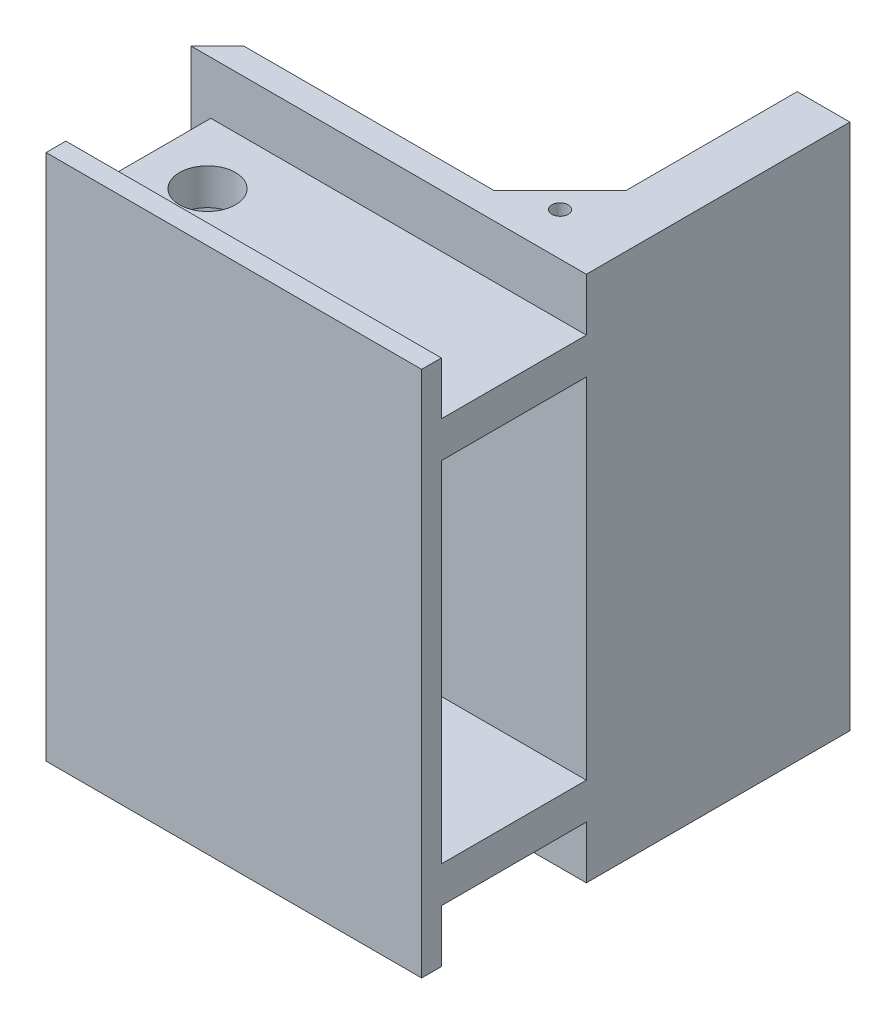
ISO-10303-21;
HEADER;
FILE_DESCRIPTION(('STEP AP214'),'2;1');
FILE_NAME('part.step','',(''),(''),'','','');
FILE_SCHEMA(('AUTOMOTIVE_DESIGN { 1 0 10303 214 1 1 1 1 }'));
ENDSEC;
DATA;
#1=APPLICATION_CONTEXT('core data for automotive mechanical design processes');
#2=APPLICATION_PROTOCOL_DEFINITION('international standard','automotive_design',2000,#1);
#3=PRODUCT_CONTEXT('',#1,'mechanical');
#4=PRODUCT('Part','Part','',(#3));
#5=PRODUCT_RELATED_PRODUCT_CATEGORY('part','',(#4));
#6=PRODUCT_DEFINITION_FORMATION('','',#4);
#7=PRODUCT_DEFINITION_CONTEXT('part definition',#1,'design');
#8=PRODUCT_DEFINITION('design','',#6,#7);
#9=PRODUCT_DEFINITION_SHAPE('','',#8);
#10=(LENGTH_UNIT() NAMED_UNIT(*) SI_UNIT(.MILLI.,.METRE.));
#11=(NAMED_UNIT(*) PLANE_ANGLE_UNIT() SI_UNIT($,.RADIAN.));
#12=(NAMED_UNIT(*) SI_UNIT($,.STERADIAN.) SOLID_ANGLE_UNIT());
#13=UNCERTAINTY_MEASURE_WITH_UNIT(LENGTH_MEASURE(1.E-05),#10,'distance_accuracy_value','');
#14=(GEOMETRIC_REPRESENTATION_CONTEXT(3) GLOBAL_UNCERTAINTY_ASSIGNED_CONTEXT((#13)) GLOBAL_UNIT_ASSIGNED_CONTEXT((#10,
#11,#12)) REPRESENTATION_CONTEXT('',''));
#15=CARTESIAN_POINT('',(0.,0.,0.));
#16=DIRECTION('',(0.,0.,1.));
#17=DIRECTION('',(1.,0.,0.));
#18=AXIS2_PLACEMENT_3D('',#15,#16,#17);
#19=CARTESIAN_POINT('',(-15.3516499079451,0.,15.687272498387));
#20=DIRECTION('',(0.707106781186544,0.,0.707106781186551));
#21=DIRECTION('',(0.,-1.,0.));
#22=AXIS2_PLACEMENT_3D('',#19,#20,#21);
#23=PLANE('',#22);
#24=DIRECTION('',(0.707106781186551,0.,-0.707106781186544));
#25=VECTOR('',#24,1.);
#26=CARTESIAN_POINT('',(-15.3516499079451,-4.00000000000001,15.687272498387));
#27=LINE('',#26,#25);
#28=CARTESIAN_POINT('',(-15.3516499079451,-4.00000000000001,15.687272498387));
#29=VERTEX_POINT('',#28);
#30=CARTESIAN_POINT('',(-5.35164990794507,-4.00000000000001,5.68727249838705));
#31=VERTEX_POINT('',#30);
#32=EDGE_CURVE('E11',#29,#31,#27,.T.);
#33=ORIENTED_EDGE('',*,*,#32,.F.);
#34=DIRECTION('',(0.,-1.,0.));
#35=VECTOR('',#34,1.);
#36=CARTESIAN_POINT('',(-15.3516499079451,0.,15.687272498387));
#37=LINE('',#36,#35);
#38=CARTESIAN_POINT('',(-15.3516499079451,0.,15.687272498387));
#39=VERTEX_POINT('',#38);
#40=EDGE_CURVE('E363',#39,#29,#37,.T.);
#41=ORIENTED_EDGE('',*,*,#40,.F.);
#42=DIRECTION('',(-0.707106781186551,0.,0.707106781186544));
#43=VECTOR('',#42,1.);
#44=CARTESIAN_POINT('',(-15.3516499079451,0.,15.687272498387));
#45=LINE('',#44,#43);
#46=CARTESIAN_POINT('',(-5.35164990794507,0.,5.68727249838709));
#47=VERTEX_POINT('',#46);
#48=EDGE_CURVE('E372',#47,#39,#45,.T.);
#49=ORIENTED_EDGE('',*,*,#48,.F.);
#50=DIRECTION('',(0.,1.,0.));
#51=VECTOR('',#50,1.);
#52=CARTESIAN_POINT('',(-5.35164990794507,0.,5.68727249838709));
#53=LINE('',#52,#51);
#54=EDGE_CURVE('E366',#31,#47,#53,.T.);
#55=ORIENTED_EDGE('',*,*,#54,.F.);
#56=EDGE_LOOP('',(#33,#41,#49,#55));
#57=FACE_BOUND('',#56,.T.);
#58=ADVANCED_FACE('F44',(#57),#23,.F.);
#59=DIRECTION('',(-0.707106781186551,0.,0.707106781186544));
#60=VECTOR('',#59,1.);
#61=CARTESIAN_POINT('',(-15.3516499079451,-76.,15.687272498387));
#62=LINE('',#61,#60);
#63=CARTESIAN_POINT('',(-5.35164990794507,-76.,5.68727249838705));
#64=VERTEX_POINT('',#63);
#65=CARTESIAN_POINT('',(-15.3516499079451,-76.,15.687272498387));
#66=VERTEX_POINT('',#65);
#67=EDGE_CURVE('E53',#64,#66,#62,.T.);
#68=ORIENTED_EDGE('',*,*,#67,.F.);
#69=CARTESIAN_POINT('',(-5.35164990794509,-80.,5.68727249838709));
#70=VERTEX_POINT('',#69);
#71=EDGE_CURVE('E367',#70,#64,#53,.T.);
#72=ORIENTED_EDGE('',*,*,#71,.F.);
#73=DIRECTION('',(0.707106781186551,0.,-0.707106781186544));
#74=VECTOR('',#73,1.);
#75=CARTESIAN_POINT('',(0.167811295221029,-80.,0.167811295221031));
#76=LINE('',#75,#74);
#77=CARTESIAN_POINT('',(-15.3516499079451,-80.,15.687272498387));
#78=VERTEX_POINT('',#77);
#79=EDGE_CURVE('E370',#78,#70,#76,.T.);
#80=ORIENTED_EDGE('',*,*,#79,.F.);
#81=EDGE_CURVE('E357',#66,#78,#37,.T.);
#82=ORIENTED_EDGE('',*,*,#81,.F.);
#83=EDGE_LOOP('',(#68,#72,#80,#82));
#84=FACE_BOUND('',#83,.T.);
#85=ADVANCED_FACE('F392',(#84),#23,.F.);
#86=CARTESIAN_POINT('',(-18.832188704779,-80.,-18.832188704779));
#87=DIRECTION('',(-0.707106781186548,0.,-0.707106781186548));
#88=DIRECTION('',(-0.707106781186548,0.,0.707106781186548));
#89=AXIS2_PLACEMENT_3D('',#86,#87,#88);
#90=PLANE('',#89);
#91=DIRECTION('',(-0.707106781186548,0.,0.707106781186548));
#92=VECTOR('',#91,1.);
#93=CARTESIAN_POINT('',(-18.832188704779,0.,-18.832188704779));
#94=LINE('',#93,#92);
#95=CARTESIAN_POINT('',(-53.3516499079451,0.,15.687272498387));
#96=VERTEX_POINT('',#95);
#97=CARTESIAN_POINT('',(-57.3516499079451,0.,19.687272498387));
#98=VERTEX_POINT('',#97);
#99=EDGE_CURVE('E332',#96,#98,#94,.T.);
#100=ORIENTED_EDGE('',*,*,#99,.F.);
#101=DIRECTION('',(0.,1.,0.));
#102=VECTOR('',#101,1.);
#103=CARTESIAN_POINT('',(-53.3516499079451,0.,15.687272498387));
#104=LINE('',#103,#102);
#105=CARTESIAN_POINT('',(-53.3516499079451,-80.,15.687272498387));
#106=VERTEX_POINT('',#105);
#107=EDGE_CURVE('E292',#106,#96,#104,.T.);
#108=ORIENTED_EDGE('',*,*,#107,.F.);
#109=DIRECTION('',(-0.707106781186548,0.,0.707106781186548));
#110=VECTOR('',#109,1.);
#111=CARTESIAN_POINT('',(-18.832188704779,-80.,-18.832188704779));
#112=LINE('',#111,#110);
#113=CARTESIAN_POINT('',(-57.3516499079451,-80.,19.687272498387));
#114=VERTEX_POINT('',#113);
#115=EDGE_CURVE('E335',#106,#114,#112,.T.);
#116=ORIENTED_EDGE('',*,*,#115,.T.);
#117=DIRECTION('',(0.,1.,0.));
#118=VECTOR('',#117,1.);
#119=CARTESIAN_POINT('',(-57.3516499079451,-80.,19.687272498387));
#120=LINE('',#119,#118);
#121=EDGE_CURVE('E345',#114,#98,#120,.T.);
#122=ORIENTED_EDGE('',*,*,#121,.T.);
#123=EDGE_LOOP('',(#100,#108,#116,#122));
#124=FACE_BOUND('',#123,.T.);
#125=ADVANCED_FACE('F412',(#124),#90,.T.);
#126=CARTESIAN_POINT('',(-54.3516499079451,-7.99999999999999,19.687272498387));
#127=DIRECTION('',(0.,1.,0.));
#128=DIRECTION('',(0.,0.,1.));
#129=AXIS2_PLACEMENT_3D('',#126,#127,#128);
#130=PLANE('',#129);
#131=CARTESIAN_POINT('',(-45.3516499079451,-7.99999999999999,29.187272498387));
#132=DIRECTION('',(0.,1.,0.));
#133=DIRECTION('',(0.,0.,1.));
#134=AXIS2_PLACEMENT_3D('',#131,#132,#133);
#135=CIRCLE('',#134,4.25);
#136=CARTESIAN_POINT('',(-45.3516499079451,-7.99999999999999,33.437272498387));
#137=VERTEX_POINT('',#136);
#138=EDGE_CURVE('E247',#137,#137,#135,.T.);
#139=ORIENTED_EDGE('',*,*,#138,.F.);
#140=EDGE_LOOP('',(#139));
#141=FACE_BOUND('',#140,.T.);
#142=DIRECTION('',(0.,0.,1.));
#143=VECTOR('',#142,1.);
#144=CARTESIAN_POINT('',(-54.3516499079451,-7.99999999999999,19.687272498387));
#145=LINE('',#144,#143);
#146=CARTESIAN_POINT('',(-54.3516499079451,-7.99999999999999,19.687272498387));
#147=VERTEX_POINT('',#146);
#148=CARTESIAN_POINT('',(-54.3516499079451,-7.99999999999999,41.6872724983871));
#149=VERTEX_POINT('',#148);
#150=EDGE_CURVE('E322',#147,#149,#145,.T.);
#151=ORIENTED_EDGE('',*,*,#150,.T.);
#152=DIRECTION('',(-1.,0.,0.));
#153=VECTOR('',#152,1.);
#154=CARTESIAN_POINT('',(2.64835009205493,-7.99999999999999,41.6872724983871));
#155=LINE('',#154,#153);
#156=CARTESIAN_POINT('',(2.64835009205493,-7.99999999999999,41.6872724983871));
#157=VERTEX_POINT('',#156);
#158=EDGE_CURVE('E238',#157,#149,#155,.T.);
#159=ORIENTED_EDGE('',*,*,#158,.F.);
#160=DIRECTION('',(0.,0.,1.));
#161=VECTOR('',#160,1.);
#162=CARTESIAN_POINT('',(2.64835009205493,-7.99999999999999,19.687272498387));
#163=LINE('',#162,#161);
#164=CARTESIAN_POINT('',(2.64835009205493,-7.99999999999999,19.687272498387));
#165=VERTEX_POINT('',#164);
#166=EDGE_CURVE('E318',#165,#157,#163,.T.);
#167=ORIENTED_EDGE('',*,*,#166,.F.);
#168=DIRECTION('',(1.,0.,0.));
#169=VECTOR('',#168,1.);
#170=CARTESIAN_POINT('',(-54.3516499079451,-7.99999999999999,19.687272498387));
#171=LINE('',#170,#169);
#172=EDGE_CURVE('E328',#147,#165,#171,.T.);
#173=ORIENTED_EDGE('',*,*,#172,.F.);
#174=EDGE_LOOP('',(#151,#159,#167,#173));
#175=FACE_BOUND('',#174,.T.);
#176=ADVANCED_FACE('F455',(#141,#175),#130,.T.);
#177=CARTESIAN_POINT('',(-54.3516499079451,-72.,19.687272498387));
#178=DIRECTION('',(0.,-1.,0.));
#179=DIRECTION('',(0.,0.,-1.));
#180=AXIS2_PLACEMENT_3D('',#177,#178,#179);
#181=PLANE('',#180);
#182=CARTESIAN_POINT('',(-45.3516499079451,-72.,29.187272498387));
#183=DIRECTION('',(0.,-1.,0.));
#184=DIRECTION('',(0.,0.,-1.));
#185=AXIS2_PLACEMENT_3D('',#182,#183,#184);
#186=CIRCLE('',#185,4.25);
#187=CARTESIAN_POINT('',(-45.3516499079451,-72.,24.937272498387));
#188=VERTEX_POINT('',#187);
#189=EDGE_CURVE('E211',#188,#188,#186,.T.);
#190=ORIENTED_EDGE('',*,*,#189,.F.);
#191=EDGE_LOOP('',(#190));
#192=FACE_BOUND('',#191,.T.);
#193=DIRECTION('',(0.,0.,-1.));
#194=VECTOR('',#193,1.);
#195=CARTESIAN_POINT('',(2.64835009205493,-72.,19.687272498387));
#196=LINE('',#195,#194);
#197=CARTESIAN_POINT('',(2.64835009205493,-72.,41.687272498387));
#198=VERTEX_POINT('',#197);
#199=CARTESIAN_POINT('',(2.64835009205493,-72.,19.687272498387));
#200=VERTEX_POINT('',#199);
#201=EDGE_CURVE('E196',#198,#200,#196,.T.);
#202=ORIENTED_EDGE('',*,*,#201,.F.);
#203=DIRECTION('',(-1.,0.,0.));
#204=VECTOR('',#203,1.);
#205=CARTESIAN_POINT('',(2.64835009205493,-72.,41.687272498387));
#206=LINE('',#205,#204);
#207=CARTESIAN_POINT('',(-54.3516499079451,-72.,41.687272498387));
#208=VERTEX_POINT('',#207);
#209=EDGE_CURVE('E198',#198,#208,#206,.T.);
#210=ORIENTED_EDGE('',*,*,#209,.T.);
#211=DIRECTION('',(0.,0.,-1.));
#212=VECTOR('',#211,1.);
#213=CARTESIAN_POINT('',(-54.3516499079451,-72.,19.687272498387));
#214=LINE('',#213,#212);
#215=CARTESIAN_POINT('',(-54.3516499079451,-72.,19.687272498387));
#216=VERTEX_POINT('',#215);
#217=EDGE_CURVE('E326',#208,#216,#214,.T.);
#218=ORIENTED_EDGE('',*,*,#217,.T.);
#219=DIRECTION('',(1.,0.,0.));
#220=VECTOR('',#219,1.);
#221=CARTESIAN_POINT('',(-54.3516499079451,-72.,19.687272498387));
#222=LINE('',#221,#220);
#223=EDGE_CURVE('E201',#216,#200,#222,.T.);
#224=ORIENTED_EDGE('',*,*,#223,.T.);
#225=EDGE_LOOP('',(#202,#210,#218,#224));
#226=FACE_BOUND('',#225,.T.);
#227=ADVANCED_FACE('F197',(#192,#226),#181,.T.);
#228=CARTESIAN_POINT('',(0.,-80.,-20.312727501613));
#229=DIRECTION('',(0.,0.,1.));
#230=DIRECTION('',(1.,0.,0.));
#231=AXIS2_PLACEMENT_3D('',#228,#229,#230);
#232=PLANE('',#231);
#233=DIRECTION('',(1.,0.,0.));
#234=VECTOR('',#233,1.);
#235=CARTESIAN_POINT('',(0.,-80.,-20.312727501613));
#236=LINE('',#235,#234);
#237=CARTESIAN_POINT('',(-5.35164990794509,-80.,-20.312727501613));
#238=VERTEX_POINT('',#237);
#239=CARTESIAN_POINT('',(2.64835009205492,-80.,-20.312727501613));
#240=VERTEX_POINT('',#239);
#241=EDGE_CURVE('E343',#238,#240,#236,.T.);
#242=ORIENTED_EDGE('',*,*,#241,.F.);
#243=DIRECTION('',(0.,-1.,0.));
#244=VECTOR('',#243,1.);
#245=CARTESIAN_POINT('',(-5.35164990794507,0.,-20.312727501613));
#246=LINE('',#245,#244);
#247=CARTESIAN_POINT('',(-5.35164990794507,0.,-20.312727501613));
#248=VERTEX_POINT('',#247);
#249=EDGE_CURVE('E289',#248,#238,#246,.T.);
#250=ORIENTED_EDGE('',*,*,#249,.F.);
#251=DIRECTION('',(1.,0.,0.));
#252=VECTOR('',#251,1.);
#253=CARTESIAN_POINT('',(0.,0.,-20.312727501613));
#254=LINE('',#253,#252);
#255=CARTESIAN_POINT('',(2.64835009205492,0.,-20.312727501613));
#256=VERTEX_POINT('',#255);
#257=EDGE_CURVE('E338',#248,#256,#254,.T.);
#258=ORIENTED_EDGE('',*,*,#257,.T.);
#259=DIRECTION('',(0.,1.,0.));
#260=VECTOR('',#259,1.);
#261=CARTESIAN_POINT('',(2.64835009205492,-80.,-20.312727501613));
#262=LINE('',#261,#260);
#263=EDGE_CURVE('E354',#240,#256,#262,.T.);
#264=ORIENTED_EDGE('',*,*,#263,.F.);
#265=EDGE_LOOP('',(#242,#250,#258,#264));
#266=FACE_BOUND('',#265,.T.);
#267=ADVANCED_FACE('F430',(#266),#232,.F.);
#268=CARTESIAN_POINT('',(2.64835009205493,-80.,0.));
#269=DIRECTION('',(-1.,0.,0.));
#270=DIRECTION('',(0.,0.,1.));
#271=AXIS2_PLACEMENT_3D('',#268,#269,#270);
#272=PLANE('',#271);
#273=DIRECTION('',(0.,1.,0.));
#274=VECTOR('',#273,1.);
#275=CARTESIAN_POINT('',(2.64835009205493,-66.5,41.687272498387));
#276=LINE('',#275,#274);
#277=CARTESIAN_POINT('',(2.64835009205493,-66.5,41.687272498387));
#278=VERTEX_POINT('',#277);
#279=CARTESIAN_POINT('',(2.64835009205493,-13.5,41.687272498387));
#280=VERTEX_POINT('',#279);
#281=EDGE_CURVE('E223',#278,#280,#276,.T.);
#282=ORIENTED_EDGE('',*,*,#281,.T.);
#283=DIRECTION('',(0.,0.,-1.));
#284=VECTOR('',#283,1.);
#285=CARTESIAN_POINT('',(2.64835009205493,-13.5,19.687272498387));
#286=LINE('',#285,#284);
#287=CARTESIAN_POINT('',(2.64835009205493,-13.5,19.687272498387));
#288=VERTEX_POINT('',#287);
#289=EDGE_CURVE('E257',#280,#288,#286,.T.);
#290=ORIENTED_EDGE('',*,*,#289,.T.);
#291=DIRECTION('',(0.,-1.,0.));
#292=VECTOR('',#291,1.);
#293=CARTESIAN_POINT('',(2.64835009205493,-13.5,19.687272498387));
#294=LINE('',#293,#292);
#295=CARTESIAN_POINT('',(2.64835009205493,-66.5,19.687272498387));
#296=VERTEX_POINT('',#295);
#297=EDGE_CURVE('E251',#288,#296,#294,.T.);
#298=ORIENTED_EDGE('',*,*,#297,.T.);
#299=DIRECTION('',(0.,0.,1.));
#300=VECTOR('',#299,1.);
#301=CARTESIAN_POINT('',(2.64835009205493,-66.5,19.687272498387));
#302=LINE('',#301,#300);
#303=EDGE_CURVE('E254',#296,#278,#302,.T.);
#304=ORIENTED_EDGE('',*,*,#303,.T.);
#305=EDGE_LOOP('',(#282,#290,#298,#304));
#306=FACE_BOUND('',#305,.T.);
#307=DIRECTION('',(0.,1.,0.));
#308=VECTOR('',#307,1.);
#309=CARTESIAN_POINT('',(2.64835009205493,-72.,41.687272498387));
#310=LINE('',#309,#308);
#311=CARTESIAN_POINT('',(2.64835009205493,-80.,41.687272498387));
#312=VERTEX_POINT('',#311);
#313=EDGE_CURVE('E61',#312,#198,#310,.T.);
#314=ORIENTED_EDGE('',*,*,#313,.T.);
#315=ORIENTED_EDGE('',*,*,#201,.T.);
#316=DIRECTION('',(0.,1.,0.));
#317=VECTOR('',#316,1.);
#318=CARTESIAN_POINT('',(2.64835009205493,-80.,19.687272498387));
#319=LINE('',#318,#317);
#320=CARTESIAN_POINT('',(2.64835009205493,-80.,19.687272498387));
#321=VERTEX_POINT('',#320);
#322=EDGE_CURVE('E358',#321,#200,#319,.T.);
#323=ORIENTED_EDGE('',*,*,#322,.F.);
#324=DIRECTION('',(0.,0.,1.));
#325=VECTOR('',#324,1.);
#326=CARTESIAN_POINT('',(2.64835009205493,-80.,0.));
#327=LINE('',#326,#325);
#328=EDGE_CURVE('E341',#240,#321,#327,.T.);
#329=ORIENTED_EDGE('',*,*,#328,.F.);
#330=ORIENTED_EDGE('',*,*,#263,.T.);
#331=DIRECTION('',(0.,0.,1.));
#332=VECTOR('',#331,1.);
#333=CARTESIAN_POINT('',(2.64835009205493,0.,0.));
#334=LINE('',#333,#332);
#335=CARTESIAN_POINT('',(2.64835009205493,0.,19.687272498387));
#336=VERTEX_POINT('',#335);
#337=EDGE_CURVE('E350',#256,#336,#334,.T.);
#338=ORIENTED_EDGE('',*,*,#337,.T.);
#339=EDGE_CURVE('E360',#165,#336,#319,.T.);
#340=ORIENTED_EDGE('',*,*,#339,.F.);
#341=ORIENTED_EDGE('',*,*,#166,.T.);
#342=DIRECTION('',(0.,1.,0.));
#343=VECTOR('',#342,1.);
#344=CARTESIAN_POINT('',(2.64835009205493,-7.99999999999999,41.6872724983871));
#345=LINE('',#344,#343);
#346=CARTESIAN_POINT('',(2.64835009205493,0.,41.6872724983871));
#347=VERTEX_POINT('',#346);
#348=EDGE_CURVE('E235',#157,#347,#345,.T.);
#349=ORIENTED_EDGE('',*,*,#348,.T.);
#350=DIRECTION('',(0.,0.,-1.));
#351=VECTOR('',#350,1.);
#352=CARTESIAN_POINT('',(2.64835009205493,0.,44.687272498387));
#353=LINE('',#352,#351);
#354=CARTESIAN_POINT('',(2.64835009205493,0.,44.687272498387));
#355=VERTEX_POINT('',#354);
#356=EDGE_CURVE('E308',#355,#347,#353,.T.);
#357=ORIENTED_EDGE('',*,*,#356,.F.);
#358=DIRECTION('',(0.,-1.,0.));
#359=VECTOR('',#358,1.);
#360=CARTESIAN_POINT('',(2.64835009205493,-7.99999999999999,44.687272498387));
#361=LINE('',#360,#359);
#362=CARTESIAN_POINT('',(2.64835009205493,-80.,44.687272498387));
#363=VERTEX_POINT('',#362);
#364=EDGE_CURVE('E206',#355,#363,#361,.T.);
#365=ORIENTED_EDGE('',*,*,#364,.T.);
#366=DIRECTION('',(0.,0.,1.));
#367=VECTOR('',#366,1.);
#368=CARTESIAN_POINT('',(2.64835009205493,-80.,44.687272498387));
#369=LINE('',#368,#367);
#370=EDGE_CURVE('E217',#312,#363,#369,.T.);
#371=ORIENTED_EDGE('',*,*,#370,.F.);
#372=EDGE_LOOP('',(#314,#315,#323,#329,#330,#338,#340,#341,#349,#357,#365,#371));
#373=FACE_BOUND('',#372,.T.);
#374=ADVANCED_FACE('F215',(#306,#373),#272,.F.);
#375=CARTESIAN_POINT('',(0.,-80.,19.687272498387));
#376=DIRECTION('',(0.,0.,1.));
#377=DIRECTION('',(1.,0.,0.));
#378=AXIS2_PLACEMENT_3D('',#375,#376,#377);
#379=PLANE('',#378);
#380=ORIENTED_EDGE('',*,*,#223,.F.);
#381=DIRECTION('',(0.,1.,0.));
#382=VECTOR('',#381,1.);
#383=CARTESIAN_POINT('',(-54.3516499079451,-7.99999999999999,19.687272498387));
#384=LINE('',#383,#382);
#385=CARTESIAN_POINT('',(-54.3516499079451,-66.5,19.687272498387));
#386=VERTEX_POINT('',#385);
#387=EDGE_CURVE('E319',#216,#386,#384,.T.);
#388=ORIENTED_EDGE('',*,*,#387,.T.);
#389=DIRECTION('',(-1.,0.,0.));
#390=VECTOR('',#389,1.);
#391=CARTESIAN_POINT('',(2.64835009205493,-66.5,19.687272498387));
#392=LINE('',#391,#390);
#393=EDGE_CURVE('E260',#296,#386,#392,.T.);
#394=ORIENTED_EDGE('',*,*,#393,.F.);
#395=ORIENTED_EDGE('',*,*,#297,.F.);
#396=DIRECTION('',(-1.,0.,0.));
#397=VECTOR('',#396,1.);
#398=CARTESIAN_POINT('',(2.64835009205493,-13.5,19.687272498387));
#399=LINE('',#398,#397);
#400=CARTESIAN_POINT('',(-54.3516499079451,-13.5,19.687272498387));
#401=VERTEX_POINT('',#400);
#402=EDGE_CURVE('E264',#288,#401,#399,.T.);
#403=ORIENTED_EDGE('',*,*,#402,.T.);
#404=EDGE_CURVE('E205',#401,#147,#384,.T.);
#405=ORIENTED_EDGE('',*,*,#404,.T.);
#406=ORIENTED_EDGE('',*,*,#172,.T.);
#407=ORIENTED_EDGE('',*,*,#339,.T.);
#408=DIRECTION('',(1.,0.,0.));
#409=VECTOR('',#408,1.);
#410=CARTESIAN_POINT('',(0.,0.,19.687272498387));
#411=LINE('',#410,#409);
#412=EDGE_CURVE('E347',#98,#336,#411,.T.);
#413=ORIENTED_EDGE('',*,*,#412,.F.);
#414=ORIENTED_EDGE('',*,*,#121,.F.);
#415=DIRECTION('',(1.,0.,0.));
#416=VECTOR('',#415,1.);
#417=CARTESIAN_POINT('',(0.,-80.,19.687272498387));
#418=LINE('',#417,#416);
#419=EDGE_CURVE('E337',#114,#321,#418,.T.);
#420=ORIENTED_EDGE('',*,*,#419,.T.);
#421=ORIENTED_EDGE('',*,*,#322,.T.);
#422=EDGE_LOOP('',(#380,#388,#394,#395,#403,#405,#406,#407,#413,#414,#420,#421));
#423=FACE_BOUND('',#422,.T.);
#424=ADVANCED_FACE('F415',(#423),#379,.T.);
#425=CARTESIAN_POINT('',(0.,-80.,0.));
#426=DIRECTION('',(0.,1.,0.));
#427=DIRECTION('',(0.,0.,1.));
#428=AXIS2_PLACEMENT_3D('',#425,#426,#427);
#429=PLANE('',#428);
#430=CARTESIAN_POINT('',(-7.85164990794509,-80.,13.1872724983871));
#431=DIRECTION('',(0.,1.,0.));
#432=DIRECTION('',(0.,0.,1.));
#433=AXIS2_PLACEMENT_3D('',#430,#431,#432);
#434=CIRCLE('',#433,1.25);
#435=CARTESIAN_POINT('',(-7.85164990794509,-80.,14.4372724983871));
#436=VERTEX_POINT('',#435);
#437=EDGE_CURVE('E268',#436,#436,#434,.T.);
#438=ORIENTED_EDGE('',*,*,#437,.T.);
#439=EDGE_LOOP('',(#438));
#440=FACE_BOUND('',#439,.T.);
#441=DIRECTION('',(-1.,0.,0.));
#442=VECTOR('',#441,1.);
#443=CARTESIAN_POINT('',(-5.35164990794509,-80.,15.687272498387));
#444=LINE('',#443,#442);
#445=EDGE_CURVE('E290',#78,#106,#444,.T.);
#446=ORIENTED_EDGE('',*,*,#445,.F.);
#447=ORIENTED_EDGE('',*,*,#79,.T.);
#448=DIRECTION('',(0.,0.,-1.));
#449=VECTOR('',#448,1.);
#450=CARTESIAN_POINT('',(-5.35164990794509,-80.,15.687272498387));
#451=LINE('',#450,#449);
#452=EDGE_CURVE('E297',#70,#238,#451,.T.);
#453=ORIENTED_EDGE('',*,*,#452,.T.);
#454=ORIENTED_EDGE('',*,*,#241,.T.);
#455=ORIENTED_EDGE('',*,*,#328,.T.);
#456=ORIENTED_EDGE('',*,*,#419,.F.);
#457=ORIENTED_EDGE('',*,*,#115,.F.);
#458=EDGE_LOOP('',(#446,#447,#453,#454,#455,#456,#457));
#459=FACE_BOUND('',#458,.T.);
#460=ADVANCED_FACE('F405',(#440,#459),#429,.F.);
#461=CARTESIAN_POINT('',(0.,0.,0.));
#462=DIRECTION('',(0.,1.,0.));
#463=DIRECTION('',(0.,0.,1.));
#464=AXIS2_PLACEMENT_3D('',#461,#462,#463);
#465=PLANE('',#464);
#466=CARTESIAN_POINT('',(-7.85164990794509,0.,13.1872724983871));
#467=DIRECTION('',(0.,1.,0.));
#468=DIRECTION('',(0.,0.,1.));
#469=AXIS2_PLACEMENT_3D('',#466,#467,#468);
#470=CIRCLE('',#469,1.25);
#471=CARTESIAN_POINT('',(-7.85164990794509,0.,14.4372724983871));
#472=VERTEX_POINT('',#471);
#473=EDGE_CURVE('E266',#472,#472,#470,.T.);
#474=ORIENTED_EDGE('',*,*,#473,.F.);
#475=EDGE_LOOP('',(#474));
#476=FACE_BOUND('',#475,.T.);
#477=DIRECTION('',(0.,0.,-1.));
#478=VECTOR('',#477,1.);
#479=CARTESIAN_POINT('',(-5.35164990794507,0.,15.687272498387));
#480=LINE('',#479,#478);
#481=EDGE_CURVE('E300',#47,#248,#480,.T.);
#482=ORIENTED_EDGE('',*,*,#481,.F.);
#483=ORIENTED_EDGE('',*,*,#48,.T.);
#484=DIRECTION('',(1.,0.,0.));
#485=VECTOR('',#484,1.);
#486=CARTESIAN_POINT('',(-5.35164990794507,0.,15.687272498387));
#487=LINE('',#486,#485);
#488=EDGE_CURVE('E294',#96,#39,#487,.T.);
#489=ORIENTED_EDGE('',*,*,#488,.F.);
#490=ORIENTED_EDGE('',*,*,#99,.T.);
#491=ORIENTED_EDGE('',*,*,#412,.T.);
#492=ORIENTED_EDGE('',*,*,#337,.F.);
#493=ORIENTED_EDGE('',*,*,#257,.F.);
#494=EDGE_LOOP('',(#482,#483,#489,#490,#491,#492,#493));
#495=FACE_BOUND('',#494,.T.);
#496=ADVANCED_FACE('F420',(#476,#495),#465,.T.);
#497=CARTESIAN_POINT('',(-54.3516499079451,-7.99999999999999,44.687272498387));
#498=DIRECTION('',(0.,0.,1.));
#499=DIRECTION('',(0.,-1.,0.));
#500=AXIS2_PLACEMENT_3D('',#497,#498,#499);
#501=PLANE('',#500);
#502=ORIENTED_EDGE('',*,*,#364,.F.);
#503=DIRECTION('',(1.,0.,0.));
#504=VECTOR('',#503,1.);
#505=CARTESIAN_POINT('',(-54.3516499079451,0.,44.687272498387));
#506=LINE('',#505,#504);
#507=CARTESIAN_POINT('',(-54.3516499079451,0.,44.687272498387));
#508=VERTEX_POINT('',#507);
#509=EDGE_CURVE('E305',#508,#355,#506,.T.);
#510=ORIENTED_EDGE('',*,*,#509,.F.);
#511=DIRECTION('',(0.,-1.,0.));
#512=VECTOR('',#511,1.);
#513=CARTESIAN_POINT('',(-54.3516499079451,-7.99999999999999,44.687272498387));
#514=LINE('',#513,#512);
#515=CARTESIAN_POINT('',(-54.3516499079451,-80.,44.687272498387));
#516=VERTEX_POINT('',#515);
#517=EDGE_CURVE('E324',#508,#516,#514,.T.);
#518=ORIENTED_EDGE('',*,*,#517,.T.);
#519=DIRECTION('',(-1.,0.,0.));
#520=VECTOR('',#519,1.);
#521=CARTESIAN_POINT('',(-54.3516499079451,-80.,44.687272498387));
#522=LINE('',#521,#520);
#523=EDGE_CURVE('E315',#363,#516,#522,.T.);
#524=ORIENTED_EDGE('',*,*,#523,.F.);
#525=EDGE_LOOP('',(#502,#510,#518,#524));
#526=FACE_BOUND('',#525,.T.);
#527=ADVANCED_FACE('F464',(#526),#501,.T.);
#528=CARTESIAN_POINT('',(-54.3516499079451,0.,0.));
#529=DIRECTION('',(-1.,0.,0.));
#530=DIRECTION('',(0.,0.,1.));
#531=AXIS2_PLACEMENT_3D('',#528,#529,#530);
#532=PLANE('',#531);
#533=ORIENTED_EDGE('',*,*,#217,.F.);
#534=DIRECTION('',(0.,1.,0.));
#535=VECTOR('',#534,1.);
#536=CARTESIAN_POINT('',(-54.3516499079451,-72.,41.687272498387));
#537=LINE('',#536,#535);
#538=CARTESIAN_POINT('',(-54.3516499079451,-80.,41.687272498387));
#539=VERTEX_POINT('',#538);
#540=EDGE_CURVE('E210',#539,#208,#537,.T.);
#541=ORIENTED_EDGE('',*,*,#540,.F.);
#542=DIRECTION('',(0.,0.,-1.));
#543=VECTOR('',#542,1.);
#544=CARTESIAN_POINT('',(-54.3516499079451,-80.,44.687272498387));
#545=LINE('',#544,#543);
#546=EDGE_CURVE('E311',#516,#539,#545,.T.);
#547=ORIENTED_EDGE('',*,*,#546,.F.);
#548=ORIENTED_EDGE('',*,*,#517,.F.);
#549=DIRECTION('',(0.,0.,1.));
#550=VECTOR('',#549,1.);
#551=CARTESIAN_POINT('',(-54.3516499079451,0.,44.687272498387));
#552=LINE('',#551,#550);
#553=CARTESIAN_POINT('',(-54.3516499079451,0.,41.6872724983871));
#554=VERTEX_POINT('',#553);
#555=EDGE_CURVE('E302',#554,#508,#552,.T.);
#556=ORIENTED_EDGE('',*,*,#555,.F.);
#557=DIRECTION('',(0.,1.,0.));
#558=VECTOR('',#557,1.);
#559=CARTESIAN_POINT('',(-54.3516499079451,-7.99999999999999,41.6872724983871));
#560=LINE('',#559,#558);
#561=EDGE_CURVE('E69',#149,#554,#560,.T.);
#562=ORIENTED_EDGE('',*,*,#561,.F.);
#563=ORIENTED_EDGE('',*,*,#150,.F.);
#564=ORIENTED_EDGE('',*,*,#404,.F.);
#565=DIRECTION('',(0.,0.,-1.));
#566=VECTOR('',#565,1.);
#567=CARTESIAN_POINT('',(-54.3516499079451,-13.5,19.687272498387));
#568=LINE('',#567,#566);
#569=CARTESIAN_POINT('',(-54.3516499079451,-13.5,41.687272498387));
#570=VERTEX_POINT('',#569);
#571=EDGE_CURVE('E255',#570,#401,#568,.T.);
#572=ORIENTED_EDGE('',*,*,#571,.F.);
#573=DIRECTION('',(0.,1.,0.));
#574=VECTOR('',#573,1.);
#575=CARTESIAN_POINT('',(-54.3516499079451,-66.5,41.687272498387));
#576=LINE('',#575,#574);
#577=CARTESIAN_POINT('',(-54.3516499079451,-66.5,41.687272498387));
#578=VERTEX_POINT('',#577);
#579=EDGE_CURVE('E227',#578,#570,#576,.T.);
#580=ORIENTED_EDGE('',*,*,#579,.F.);
#581=DIRECTION('',(0.,0.,1.));
#582=VECTOR('',#581,1.);
#583=CARTESIAN_POINT('',(-54.3516499079451,-66.5,19.687272498387));
#584=LINE('',#583,#582);
#585=EDGE_CURVE('E250',#386,#578,#584,.T.);
#586=ORIENTED_EDGE('',*,*,#585,.F.);
#587=ORIENTED_EDGE('',*,*,#387,.F.);
#588=EDGE_LOOP('',(#533,#541,#547,#548,#556,#562,#563,#564,#572,#580,#586,#587));
#589=FACE_BOUND('',#588,.T.);
#590=ADVANCED_FACE('F437',(#589),#532,.T.);
#591=CARTESIAN_POINT('',(0.,-80.,0.));
#592=DIRECTION('',(0.,-1.,0.));
#593=DIRECTION('',(0.,0.,-1.));
#594=AXIS2_PLACEMENT_3D('',#591,#592,#593);
#595=PLANE('',#594);
#596=DIRECTION('',(-1.,0.,0.));
#597=VECTOR('',#596,1.);
#598=CARTESIAN_POINT('',(2.64835009205493,-80.,41.687272498387));
#599=LINE('',#598,#597);
#600=EDGE_CURVE('E212',#312,#539,#599,.T.);
#601=ORIENTED_EDGE('',*,*,#600,.F.);
#602=ORIENTED_EDGE('',*,*,#370,.T.);
#603=ORIENTED_EDGE('',*,*,#523,.T.);
#604=ORIENTED_EDGE('',*,*,#546,.T.);
#605=EDGE_LOOP('',(#601,#602,#603,#604));
#606=FACE_BOUND('',#605,.T.);
#607=ADVANCED_FACE('F468',(#606),#595,.T.);
#608=CARTESIAN_POINT('',(0.,0.,0.));
#609=DIRECTION('',(0.,-1.,0.));
#610=DIRECTION('',(0.,0.,-1.));
#611=AXIS2_PLACEMENT_3D('',#608,#609,#610);
#612=PLANE('',#611);
#613=ORIENTED_EDGE('',*,*,#356,.T.);
#614=DIRECTION('',(-1.,0.,0.));
#615=VECTOR('',#614,1.);
#616=CARTESIAN_POINT('',(2.64835009205493,0.,41.6872724983871));
#617=LINE('',#616,#615);
#618=EDGE_CURVE('E230',#347,#554,#617,.T.);
#619=ORIENTED_EDGE('',*,*,#618,.T.);
#620=ORIENTED_EDGE('',*,*,#555,.T.);
#621=ORIENTED_EDGE('',*,*,#509,.T.);
#622=EDGE_LOOP('',(#613,#619,#620,#621));
#623=FACE_BOUND('',#622,.T.);
#624=ADVANCED_FACE('F460',(#623),#612,.F.);
#625=CARTESIAN_POINT('',(-5.35164990794507,0.,15.687272498387));
#626=DIRECTION('',(1.,0.,0.));
#627=DIRECTION('',(0.,1.,0.));
#628=AXIS2_PLACEMENT_3D('',#625,#626,#627);
#629=PLANE('',#628);
#630=ORIENTED_EDGE('',*,*,#452,.F.);
#631=ORIENTED_EDGE('',*,*,#71,.T.);
#632=DIRECTION('',(0.,0.,1.));
#633=VECTOR('',#632,1.);
#634=CARTESIAN_POINT('',(-5.35164990794507,-76.,5.68727249838705));
#635=LINE('',#634,#633);
#636=CARTESIAN_POINT('',(-5.35164990794507,-76.,15.687272498387));
#637=VERTEX_POINT('',#636);
#638=EDGE_CURVE('E283',#64,#637,#635,.T.);
#639=ORIENTED_EDGE('',*,*,#638,.T.);
#640=DIRECTION('',(0.,-1.,0.));
#641=VECTOR('',#640,1.);
#642=CARTESIAN_POINT('',(-5.35164990794507,-76.,15.687272498387));
#643=LINE('',#642,#641);
#644=CARTESIAN_POINT('',(-5.35164990794507,-4.00000000000001,15.687272498387));
#645=VERTEX_POINT('',#644);
#646=EDGE_CURVE('E279',#645,#637,#643,.T.);
#647=ORIENTED_EDGE('',*,*,#646,.F.);
#648=DIRECTION('',(0.,0.,1.));
#649=VECTOR('',#648,1.);
#650=CARTESIAN_POINT('',(-5.35164990794507,-4.00000000000001,5.68727249838705));
#651=LINE('',#650,#649);
#652=EDGE_CURVE('E286',#31,#645,#651,.T.);
#653=ORIENTED_EDGE('',*,*,#652,.F.);
#654=ORIENTED_EDGE('',*,*,#54,.T.);
#655=ORIENTED_EDGE('',*,*,#481,.T.);
#656=ORIENTED_EDGE('',*,*,#249,.T.);
#657=EDGE_LOOP('',(#630,#631,#639,#647,#653,#654,#655,#656));
#658=FACE_BOUND('',#657,.T.);
#659=ADVANCED_FACE('F401',(#658),#629,.F.);
#660=CARTESIAN_POINT('',(0.,0.,15.687272498387));
#661=DIRECTION('',(0.,0.,-1.));
#662=DIRECTION('',(-1.,0.,0.));
#663=AXIS2_PLACEMENT_3D('',#660,#661,#662);
#664=PLANE('',#663);
#665=ORIENTED_EDGE('',*,*,#107,.T.);
#666=ORIENTED_EDGE('',*,*,#488,.T.);
#667=ORIENTED_EDGE('',*,*,#40,.T.);
#668=DIRECTION('',(1.,0.,0.));
#669=VECTOR('',#668,1.);
#670=CARTESIAN_POINT('',(-53.3516499079451,-4.,15.687272498387));
#671=LINE('',#670,#669);
#672=EDGE_CURVE('E277',#29,#645,#671,.T.);
#673=ORIENTED_EDGE('',*,*,#672,.T.);
#674=ORIENTED_EDGE('',*,*,#646,.T.);
#675=DIRECTION('',(-1.,0.,0.));
#676=VECTOR('',#675,1.);
#677=CARTESIAN_POINT('',(-53.3516499079451,-76.,15.687272498387));
#678=LINE('',#677,#676);
#679=EDGE_CURVE('E281',#637,#66,#678,.T.);
#680=ORIENTED_EDGE('',*,*,#679,.T.);
#681=ORIENTED_EDGE('',*,*,#81,.T.);
#682=ORIENTED_EDGE('',*,*,#445,.T.);
#683=EDGE_LOOP('',(#665,#666,#667,#673,#674,#680,#681,#682));
#684=FACE_BOUND('',#683,.T.);
#685=ADVANCED_FACE('F395',(#684),#664,.T.);
#686=CARTESIAN_POINT('',(-53.3516499079451,-4.,5.68727249838705));
#687=DIRECTION('',(0.,-1.,0.));
#688=DIRECTION('',(1.,0.,0.));
#689=AXIS2_PLACEMENT_3D('',#686,#687,#688);
#690=PLANE('',#689);
#691=CARTESIAN_POINT('',(-7.85164990794509,-4.,13.1872724983871));
#692=DIRECTION('',(0.,-1.,0.));
#693=DIRECTION('',(1.,0.,0.));
#694=AXIS2_PLACEMENT_3D('',#691,#692,#693);
#695=CIRCLE('',#694,1.25);
#696=CARTESIAN_POINT('',(-6.60164990794509,-4.,13.1872724983871));
#697=VERTEX_POINT('',#696);
#698=EDGE_CURVE('E274',#697,#697,#695,.T.);
#699=ORIENTED_EDGE('',*,*,#698,.F.);
#700=EDGE_LOOP('',(#699));
#701=FACE_BOUND('',#700,.T.);
#702=ORIENTED_EDGE('',*,*,#32,.T.);
#703=ORIENTED_EDGE('',*,*,#652,.T.);
#704=ORIENTED_EDGE('',*,*,#672,.F.);
#705=EDGE_LOOP('',(#702,#703,#704));
#706=FACE_BOUND('',#705,.T.);
#707=ADVANCED_FACE('F384',(#701,#706),#690,.T.);
#708=CARTESIAN_POINT('',(-53.3516499079451,-76.,5.68727249838705));
#709=DIRECTION('',(0.,1.,0.));
#710=DIRECTION('',(0.,0.,1.));
#711=AXIS2_PLACEMENT_3D('',#708,#709,#710);
#712=PLANE('',#711);
#713=CARTESIAN_POINT('',(-7.85164990794509,-76.,13.1872724983871));
#714=DIRECTION('',(0.,1.,0.));
#715=DIRECTION('',(0.,0.,1.));
#716=AXIS2_PLACEMENT_3D('',#713,#714,#715);
#717=CIRCLE('',#716,1.25);
#718=CARTESIAN_POINT('',(-7.85164990794509,-76.,14.4372724983871));
#719=VERTEX_POINT('',#718);
#720=EDGE_CURVE('E271',#719,#719,#717,.T.);
#721=ORIENTED_EDGE('',*,*,#720,.F.);
#722=EDGE_LOOP('',(#721));
#723=FACE_BOUND('',#722,.T.);
#724=ORIENTED_EDGE('',*,*,#67,.T.);
#725=ORIENTED_EDGE('',*,*,#679,.F.);
#726=ORIENTED_EDGE('',*,*,#638,.F.);
#727=EDGE_LOOP('',(#724,#725,#726));
#728=FACE_BOUND('',#727,.T.);
#729=ADVANCED_FACE('F381',(#723,#728),#712,.T.);
#730=CARTESIAN_POINT('',(-7.85164990794509,-80.,13.1872724983871));
#731=DIRECTION('',(0.,1.,0.));
#732=DIRECTION('',(0.,0.,1.));
#733=AXIS2_PLACEMENT_3D('',#730,#731,#732);
#734=CYLINDRICAL_SURFACE('',#733,1.25);
#735=ORIENTED_EDGE('',*,*,#720,.T.);
#736=EDGE_LOOP('',(#735));
#737=FACE_BOUND('',#736,.T.);
#738=ORIENTED_EDGE('',*,*,#437,.F.);
#739=EDGE_LOOP('',(#738));
#740=FACE_BOUND('',#739,.T.);
#741=ADVANCED_FACE('F378',(#737,#740),#734,.F.);
#742=ORIENTED_EDGE('',*,*,#698,.T.);
#743=EDGE_LOOP('',(#742));
#744=FACE_BOUND('',#743,.T.);
#745=ORIENTED_EDGE('',*,*,#473,.T.);
#746=EDGE_LOOP('',(#745));
#747=FACE_BOUND('',#746,.T.);
#748=ADVANCED_FACE('F523',(#744,#747),#734,.F.);
#749=CARTESIAN_POINT('',(2.64835009205493,-13.5,19.687272498387));
#750=DIRECTION('',(0.,1.,0.));
#751=DIRECTION('',(0.,0.,1.));
#752=AXIS2_PLACEMENT_3D('',#749,#750,#751);
#753=PLANE('',#752);
#754=CARTESIAN_POINT('',(-45.3516499079451,-13.5,29.187272498387));
#755=DIRECTION('',(0.,1.,0.));
#756=DIRECTION('',(0.,0.,1.));
#757=AXIS2_PLACEMENT_3D('',#754,#755,#756);
#758=CIRCLE('',#757,4.25);
#759=CARTESIAN_POINT('',(-45.3516499079451,-13.5,33.437272498387));
#760=VERTEX_POINT('',#759);
#761=EDGE_CURVE('E244',#760,#760,#758,.T.);
#762=ORIENTED_EDGE('',*,*,#761,.T.);
#763=EDGE_LOOP('',(#762));
#764=FACE_BOUND('',#763,.T.);
#765=ORIENTED_EDGE('',*,*,#571,.T.);
#766=ORIENTED_EDGE('',*,*,#402,.F.);
#767=ORIENTED_EDGE('',*,*,#289,.F.);
#768=DIRECTION('',(-1.,0.,0.));
#769=VECTOR('',#768,1.);
#770=CARTESIAN_POINT('',(2.64835009205493,-13.5,41.687272498387));
#771=LINE('',#770,#769);
#772=EDGE_CURVE('E220',#280,#570,#771,.T.);
#773=ORIENTED_EDGE('',*,*,#772,.T.);
#774=EDGE_LOOP('',(#765,#766,#767,#773));
#775=FACE_BOUND('',#774,.T.);
#776=ADVANCED_FACE('F450',(#764,#775),#753,.F.);
#777=CARTESIAN_POINT('',(2.64835009205493,-66.5,19.687272498387));
#778=DIRECTION('',(0.,-1.,0.));
#779=DIRECTION('',(0.,0.,-1.));
#780=AXIS2_PLACEMENT_3D('',#777,#778,#779);
#781=PLANE('',#780);
#782=CARTESIAN_POINT('',(-45.3516499079451,-66.5,29.187272498387));
#783=DIRECTION('',(0.,-1.,0.));
#784=DIRECTION('',(0.,0.,-1.));
#785=AXIS2_PLACEMENT_3D('',#782,#783,#784);
#786=CIRCLE('',#785,4.25);
#787=CARTESIAN_POINT('',(-45.3516499079451,-66.5,24.937272498387));
#788=VERTEX_POINT('',#787);
#789=EDGE_CURVE('E48',#788,#788,#786,.T.);
#790=ORIENTED_EDGE('',*,*,#789,.T.);
#791=EDGE_LOOP('',(#790));
#792=FACE_BOUND('',#791,.T.);
#793=ORIENTED_EDGE('',*,*,#585,.T.);
#794=DIRECTION('',(-1.,0.,0.));
#795=VECTOR('',#794,1.);
#796=CARTESIAN_POINT('',(2.64835009205493,-66.5,41.687272498387));
#797=LINE('',#796,#795);
#798=EDGE_CURVE('E226',#278,#578,#797,.T.);
#799=ORIENTED_EDGE('',*,*,#798,.F.);
#800=ORIENTED_EDGE('',*,*,#303,.F.);
#801=ORIENTED_EDGE('',*,*,#393,.T.);
#802=EDGE_LOOP('',(#793,#799,#800,#801));
#803=FACE_BOUND('',#802,.T.);
#804=ADVANCED_FACE('F441',(#792,#803),#781,.F.);
#805=CARTESIAN_POINT('',(-45.3516499079451,0.,29.187272498387));
#806=DIRECTION('',(0.,-1.,0.));
#807=DIRECTION('',(0.,0.,-1.));
#808=AXIS2_PLACEMENT_3D('',#805,#806,#807);
#809=CYLINDRICAL_SURFACE('',#808,4.25);
#810=ORIENTED_EDGE('',*,*,#189,.T.);
#811=EDGE_LOOP('',(#810));
#812=FACE_BOUND('',#811,.T.);
#813=ORIENTED_EDGE('',*,*,#789,.F.);
#814=EDGE_LOOP('',(#813));
#815=FACE_BOUND('',#814,.T.);
#816=ADVANCED_FACE('F510',(#812,#815),#809,.F.);
#817=ORIENTED_EDGE('',*,*,#138,.T.);
#818=EDGE_LOOP('',(#817));
#819=FACE_BOUND('',#818,.T.);
#820=ORIENTED_EDGE('',*,*,#761,.F.);
#821=EDGE_LOOP('',(#820));
#822=FACE_BOUND('',#821,.T.);
#823=ADVANCED_FACE('F513',(#819,#822),#809,.F.);
#824=CARTESIAN_POINT('',(2.64835009205493,-66.5,41.687272498387));
#825=DIRECTION('',(0.,0.,1.));
#826=DIRECTION('',(1.,0.,0.));
#827=AXIS2_PLACEMENT_3D('',#824,#825,#826);
#828=PLANE('',#827);
#829=ORIENTED_EDGE('',*,*,#579,.T.);
#830=ORIENTED_EDGE('',*,*,#772,.F.);
#831=ORIENTED_EDGE('',*,*,#281,.F.);
#832=ORIENTED_EDGE('',*,*,#798,.T.);
#833=EDGE_LOOP('',(#829,#830,#831,#832));
#834=FACE_BOUND('',#833,.T.);
#835=ADVANCED_FACE('F444',(#834),#828,.F.);
#836=CARTESIAN_POINT('',(2.64835009205493,-7.99999999999999,41.6872724983871));
#837=DIRECTION('',(0.,0.,1.));
#838=DIRECTION('',(1.,0.,0.));
#839=AXIS2_PLACEMENT_3D('',#836,#837,#838);
#840=PLANE('',#839);
#841=ORIENTED_EDGE('',*,*,#561,.T.);
#842=ORIENTED_EDGE('',*,*,#618,.F.);
#843=ORIENTED_EDGE('',*,*,#348,.F.);
#844=ORIENTED_EDGE('',*,*,#158,.T.);
#845=EDGE_LOOP('',(#841,#842,#843,#844));
#846=FACE_BOUND('',#845,.T.);
#847=ADVANCED_FACE('F457',(#846),#840,.F.);
#848=CARTESIAN_POINT('',(2.64835009205493,-72.,41.687272498387));
#849=DIRECTION('',(0.,0.,1.));
#850=DIRECTION('',(1.,0.,0.));
#851=AXIS2_PLACEMENT_3D('',#848,#849,#850);
#852=PLANE('',#851);
#853=ORIENTED_EDGE('',*,*,#540,.T.);
#854=ORIENTED_EDGE('',*,*,#209,.F.);
#855=ORIENTED_EDGE('',*,*,#313,.F.);
#856=ORIENTED_EDGE('',*,*,#600,.T.);
#857=EDGE_LOOP('',(#853,#854,#855,#856));
#858=FACE_BOUND('',#857,.T.);
#859=ADVANCED_FACE('F208',(#858),#852,.F.);
#860=CLOSED_SHELL('',(#58,#85,#125,#176,#227,#267,#374,#424,#460,#496,#527,#590,#607,#624,#659,
#685,#707,#729,#741,#748,#776,#804,#816,#823,#835,#847,#859));
#861=MANIFOLD_SOLID_BREP('B2',#860);
#862=ADVANCED_BREP_SHAPE_REPRESENTATION('',(#18,#861),#14);
#863=SHAPE_DEFINITION_REPRESENTATION(#9,#862);
ENDSEC;
END-ISO-10303-21;
